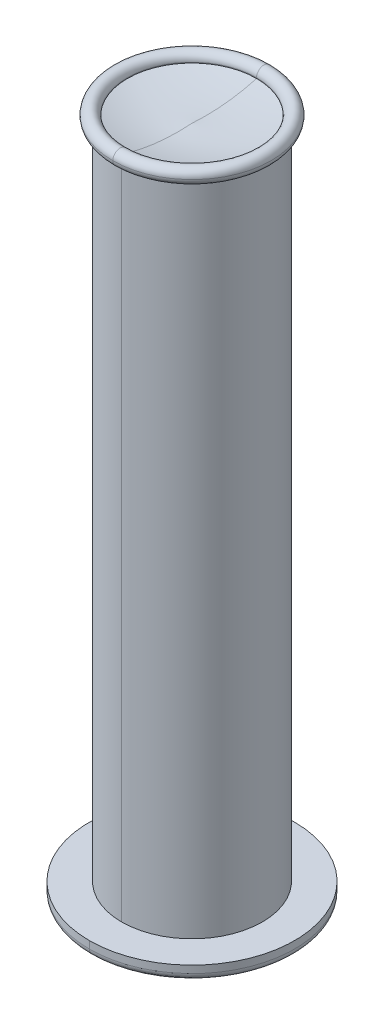
ISO-10303-21;
HEADER;
FILE_DESCRIPTION(('STEP AP214'),'2;1');
FILE_NAME('part.step','',(''),(''),'','','');
FILE_SCHEMA(('AUTOMOTIVE_DESIGN { 1 0 10303 214 1 1 1 1 }'));
ENDSEC;
DATA;
#1=APPLICATION_CONTEXT('core data for automotive mechanical design processes');
#2=APPLICATION_PROTOCOL_DEFINITION('international standard','automotive_design',2000,#1);
#3=PRODUCT_CONTEXT('',#1,'mechanical');
#4=PRODUCT('Part','Part','',(#3));
#5=PRODUCT_RELATED_PRODUCT_CATEGORY('part','',(#4));
#6=PRODUCT_DEFINITION_FORMATION('','',#4);
#7=PRODUCT_DEFINITION_CONTEXT('part definition',#1,'design');
#8=PRODUCT_DEFINITION('design','',#6,#7);
#9=PRODUCT_DEFINITION_SHAPE('','',#8);
#10=(LENGTH_UNIT() NAMED_UNIT(*) SI_UNIT(.MILLI.,.METRE.));
#11=(NAMED_UNIT(*) PLANE_ANGLE_UNIT() SI_UNIT($,.RADIAN.));
#12=(NAMED_UNIT(*) SI_UNIT($,.STERADIAN.) SOLID_ANGLE_UNIT());
#13=UNCERTAINTY_MEASURE_WITH_UNIT(LENGTH_MEASURE(1.E-05),#10,'distance_accuracy_value','');
#14=(GEOMETRIC_REPRESENTATION_CONTEXT(3) GLOBAL_UNCERTAINTY_ASSIGNED_CONTEXT((#13)) GLOBAL_UNIT_ASSIGNED_CONTEXT((#10,
#11,#12)) REPRESENTATION_CONTEXT('',''));
#15=CARTESIAN_POINT('',(0.,0.,0.));
#16=DIRECTION('',(0.,0.,1.));
#17=DIRECTION('',(1.,0.,0.));
#18=AXIS2_PLACEMENT_3D('',#15,#16,#17);
#19=CARTESIAN_POINT('',(0.,28.7584799102785,0.));
#20=DIRECTION('',(0.,-1.,0.));
#21=DIRECTION('',(0.,0.,-1.));
#22=AXIS2_PLACEMENT_3D('',#19,#20,#21);
#23=TOROIDAL_SURFACE('',#22,3.1143963501519,0.3175);
#24=CARTESIAN_POINT('',(0.,28.7584799102785,0.));
#25=DIRECTION('',(0.,-1.,0.));
#26=DIRECTION('',(0.,0.,-1.));
#27=AXIS2_PLACEMENT_3D('',#24,#25,#26);
#28=CIRCLE('',#27,2.79689635015189);
#29=CARTESIAN_POINT('',(0.,28.7584799102785,2.79689635015189));
#30=VERTEX_POINT('',#29);
#31=CARTESIAN_POINT('',(0.,28.7584799102785,-2.79689635015189));
#32=VERTEX_POINT('',#31);
#33=EDGE_CURVE('E145',#30,#32,#28,.T.);
#34=ORIENTED_EDGE('',*,*,#33,.F.);
#35=CARTESIAN_POINT('',(0.,28.7584799102785,3.1143963501519));
#36=DIRECTION('',(1.,0.,0.));
#37=DIRECTION('',(0.,0.,-1.));
#38=AXIS2_PLACEMENT_3D('',#35,#36,#37);
#39=CIRCLE('',#38,0.3175);
#40=CARTESIAN_POINT('',(0.,28.7269838744503,2.79846241761676));
#41=VERTEX_POINT('',#40);
#42=EDGE_CURVE('E177',#41,#30,#39,.T.);
#43=ORIENTED_EDGE('',*,*,#42,.F.);
#44=CARTESIAN_POINT('',(0.,28.7269838744503,0.));
#45=DIRECTION('',(0.,-1.,0.));
#46=DIRECTION('',(0.,0.,-1.));
#47=AXIS2_PLACEMENT_3D('',#44,#45,#46);
#48=CIRCLE('',#47,2.79846241761676);
#49=CARTESIAN_POINT('',(0.,28.7269838744503,-2.79846241761676));
#50=VERTEX_POINT('',#49);
#51=EDGE_CURVE('E140',#41,#50,#48,.T.);
#52=ORIENTED_EDGE('',*,*,#51,.T.);
#53=CARTESIAN_POINT('',(0.,28.7584799102785,-3.1143963501519));
#54=DIRECTION('',(-1.,0.,0.));
#55=DIRECTION('',(0.,0.,1.));
#56=AXIS2_PLACEMENT_3D('',#53,#54,#55);
#57=CIRCLE('',#56,0.3175);
#58=EDGE_CURVE('E178',#50,#32,#57,.T.);
#59=ORIENTED_EDGE('',*,*,#58,.T.);
#60=EDGE_LOOP('',(#34,#43,#52,#59));
#61=FACE_BOUND('',#60,.T.);
#62=ADVANCED_FACE('F16',(#61),#23,.T.);
#63=CARTESIAN_POINT('',(0.,0.,0.));
#64=DIRECTION('',(0.,-1.,0.));
#65=DIRECTION('',(0.,0.,-1.));
#66=AXIS2_PLACEMENT_3D('',#63,#64,#65);
#67=CYLINDRICAL_SURFACE('',#66,3.048);
#68=DIRECTION('',(0.,-1.,0.));
#69=VECTOR('',#68,1.);
#70=CARTESIAN_POINT('',(0.,0.,3.048));
#71=LINE('',#70,#69);
#72=CARTESIAN_POINT('',(0.,28.448,3.048));
#73=VERTEX_POINT('',#72);
#74=CARTESIAN_POINT('',(0.,0.,3.048));
#75=VERTEX_POINT('',#74);
#76=EDGE_CURVE('E186',#73,#75,#71,.T.);
#77=ORIENTED_EDGE('',*,*,#76,.F.);
#78=CARTESIAN_POINT('',(0.,28.448,0.));
#79=DIRECTION('',(0.,-1.,0.));
#80=DIRECTION('',(0.,0.,-1.));
#81=AXIS2_PLACEMENT_3D('',#78,#79,#80);
#82=CIRCLE('',#81,3.048);
#83=CARTESIAN_POINT('',(0.,28.448,-3.048));
#84=VERTEX_POINT('',#83);
#85=EDGE_CURVE('E146',#73,#84,#82,.T.);
#86=ORIENTED_EDGE('',*,*,#85,.T.);
#87=DIRECTION('',(0.,-1.,0.));
#88=VECTOR('',#87,1.);
#89=CARTESIAN_POINT('',(0.,0.,-3.048));
#90=LINE('',#89,#88);
#91=CARTESIAN_POINT('',(0.,0.,-3.048));
#92=VERTEX_POINT('',#91);
#93=EDGE_CURVE('E187',#84,#92,#90,.T.);
#94=ORIENTED_EDGE('',*,*,#93,.T.);
#95=CARTESIAN_POINT('',(0.,0.,0.));
#96=DIRECTION('',(0.,-1.,0.));
#97=DIRECTION('',(0.,0.,-1.));
#98=AXIS2_PLACEMENT_3D('',#95,#96,#97);
#99=CIRCLE('',#98,3.048);
#100=EDGE_CURVE('E11',#75,#92,#99,.T.);
#101=ORIENTED_EDGE('',*,*,#100,.F.);
#102=EDGE_LOOP('',(#77,#86,#94,#101));
#103=FACE_BOUND('',#102,.T.);
#104=ADVANCED_FACE('F227',(#103),#67,.T.);
#105=CARTESIAN_POINT('',(4.445,0.,0.));
#106=DIRECTION('',(0.,1.,0.));
#107=DIRECTION('',(1.,0.,0.));
#108=AXIS2_PLACEMENT_3D('',#105,#106,#107);
#109=PLANE('',#108);
#110=CARTESIAN_POINT('',(0.,0.,0.));
#111=DIRECTION('',(0.,-1.,0.));
#112=DIRECTION('',(0.,0.,-1.));
#113=AXIS2_PLACEMENT_3D('',#110,#111,#112);
#114=CIRCLE('',#113,3.048);
#115=EDGE_CURVE('E192',#92,#75,#114,.T.);
#116=ORIENTED_EDGE('',*,*,#115,.T.);
#117=ORIENTED_EDGE('',*,*,#100,.T.);
#118=EDGE_LOOP('',(#116,#117));
#119=FACE_BOUND('',#118,.T.);
#120=CARTESIAN_POINT('',(0.,0.,0.));
#121=DIRECTION('',(0.,-1.,0.));
#122=DIRECTION('',(0.,0.,-1.));
#123=AXIS2_PLACEMENT_3D('',#120,#121,#122);
#124=CIRCLE('',#123,4.445);
#125=CARTESIAN_POINT('',(0.,0.,-4.445));
#126=VERTEX_POINT('',#125);
#127=CARTESIAN_POINT('',(0.,0.,4.445));
#128=VERTEX_POINT('',#127);
#129=EDGE_CURVE('E191',#126,#128,#124,.T.);
#130=ORIENTED_EDGE('',*,*,#129,.F.);
#131=CARTESIAN_POINT('',(0.,0.,0.));
#132=DIRECTION('',(0.,-1.,0.));
#133=DIRECTION('',(0.,0.,-1.));
#134=AXIS2_PLACEMENT_3D('',#131,#132,#133);
#135=CIRCLE('',#134,4.445);
#136=EDGE_CURVE('E27',#128,#126,#135,.T.);
#137=ORIENTED_EDGE('',*,*,#136,.F.);
#138=EDGE_LOOP('',(#130,#137));
#139=FACE_BOUND('',#138,.T.);
#140=ADVANCED_FACE('F225',(#119,#139),#109,.T.);
#141=CARTESIAN_POINT('',(0.,0.,0.));
#142=DIRECTION('',(0.,-1.,0.));
#143=DIRECTION('',(0.,0.,-1.));
#144=AXIS2_PLACEMENT_3D('',#141,#142,#143);
#145=CYLINDRICAL_SURFACE('',#144,4.445);
#146=DIRECTION('',(0.,-1.,0.));
#147=VECTOR('',#146,1.);
#148=CARTESIAN_POINT('',(0.,0.,4.445));
#149=LINE('',#148,#147);
#150=CARTESIAN_POINT('',(0.,-0.3175,4.445));
#151=VERTEX_POINT('',#150);
#152=EDGE_CURVE('E134',#128,#151,#149,.T.);
#153=ORIENTED_EDGE('',*,*,#152,.F.);
#154=ORIENTED_EDGE('',*,*,#136,.T.);
#155=DIRECTION('',(0.,-1.,0.));
#156=VECTOR('',#155,1.);
#157=CARTESIAN_POINT('',(0.,0.,-4.445));
#158=LINE('',#157,#156);
#159=CARTESIAN_POINT('',(0.,-0.3175,-4.445));
#160=VERTEX_POINT('',#159);
#161=EDGE_CURVE('E120',#126,#160,#158,.T.);
#162=ORIENTED_EDGE('',*,*,#161,.T.);
#163=CARTESIAN_POINT('',(0.,-0.3175,0.));
#164=DIRECTION('',(0.,-1.,0.));
#165=DIRECTION('',(0.,0.,-1.));
#166=AXIS2_PLACEMENT_3D('',#163,#164,#165);
#167=CIRCLE('',#166,4.445);
#168=EDGE_CURVE('E108',#151,#160,#167,.T.);
#169=ORIENTED_EDGE('',*,*,#168,.F.);
#170=EDGE_LOOP('',(#153,#154,#162,#169));
#171=FACE_BOUND('',#170,.T.);
#172=ADVANCED_FACE('F222',(#171),#145,.T.);
#173=CARTESIAN_POINT('',(0.,-0.3175,0.));
#174=DIRECTION('',(0.,-1.,0.));
#175=DIRECTION('',(0.,0.,-1.));
#176=AXIS2_PLACEMENT_3D('',#173,#174,#175);
#177=TOROIDAL_SURFACE('',#176,4.1275,0.3175);
#178=CARTESIAN_POINT('',(0.,-0.3175,4.1275));
#179=DIRECTION('',(1.,0.,0.));
#180=DIRECTION('',(0.,0.,-1.));
#181=AXIS2_PLACEMENT_3D('',#178,#179,#180);
#182=CIRCLE('',#181,0.3175);
#183=CARTESIAN_POINT('',(0.,-0.635,4.1275));
#184=VERTEX_POINT('',#183);
#185=EDGE_CURVE('E20',#151,#184,#182,.T.);
#186=ORIENTED_EDGE('',*,*,#185,.F.);
#187=ORIENTED_EDGE('',*,*,#168,.T.);
#188=CARTESIAN_POINT('',(0.,-0.3175,-4.1275));
#189=DIRECTION('',(-1.,0.,0.));
#190=DIRECTION('',(0.,0.,1.));
#191=AXIS2_PLACEMENT_3D('',#188,#189,#190);
#192=CIRCLE('',#191,0.3175);
#193=CARTESIAN_POINT('',(0.,-0.635,-4.1275));
#194=VERTEX_POINT('',#193);
#195=EDGE_CURVE('E104',#160,#194,#192,.T.);
#196=ORIENTED_EDGE('',*,*,#195,.T.);
#197=CARTESIAN_POINT('',(0.,-0.635,0.));
#198=DIRECTION('',(0.,-1.,0.));
#199=DIRECTION('',(0.,0.,-1.));
#200=AXIS2_PLACEMENT_3D('',#197,#198,#199);
#201=CIRCLE('',#200,4.1275);
#202=EDGE_CURVE('E98',#184,#194,#201,.T.);
#203=ORIENTED_EDGE('',*,*,#202,.F.);
#204=EDGE_LOOP('',(#186,#187,#196,#203));
#205=FACE_BOUND('',#204,.T.);
#206=ADVANCED_FACE('F100',(#205),#177,.T.);
#207=CARTESIAN_POINT('',(0.,-0.635,0.));
#208=DIRECTION('',(0.,-1.,0.));
#209=DIRECTION('',(0.,0.,-1.));
#210=AXIS2_PLACEMENT_3D('',#207,#208,#209);
#211=PLANE('',#210);
#212=CARTESIAN_POINT('',(0.,-0.635,0.));
#213=DIRECTION('',(0.,-1.,0.));
#214=DIRECTION('',(0.,0.,-1.));
#215=AXIS2_PLACEMENT_3D('',#212,#213,#214);
#216=CIRCLE('',#215,4.1275);
#217=EDGE_CURVE('E110',#194,#184,#216,.T.);
#218=ORIENTED_EDGE('',*,*,#217,.T.);
#219=ORIENTED_EDGE('',*,*,#202,.T.);
#220=EDGE_LOOP('',(#218,#219));
#221=FACE_BOUND('',#220,.T.);
#222=ADVANCED_FACE('F111',(#221),#211,.T.);
#223=CARTESIAN_POINT('',(0.,36.5958304601756,-0.600865186460658));
#224=DIRECTION('',(-1.,0.,0.));
#225=DIRECTION('',(0.,0.,-1.));
#226=AXIS2_PLACEMENT_3D('',#223,#224,#225);
#227=CIRCLE('',#226,8.1699559472537);
#228=TRIMMED_CURVE('',#227,(PARAMETER_VALUE(-1.6444084968151)),
(PARAMETER_VALUE(1.6444084968151)),.T.,.PARAMETER.);
#229=CARTESIAN_POINT('',(0.,36.5958304601756,0.));
#230=DIRECTION('',(0.,-1.,0.));
#231=AXIS1_PLACEMENT('',#229,#230);
#232=SURFACE_OF_REVOLUTION('',#228,#231);
#233=CARTESIAN_POINT('',(0.,36.5958304601756,0.600865186460658));
#234=DIRECTION('',(1.,0.,0.));
#235=DIRECTION('',(0.,0.,-1.));
#236=AXIS2_PLACEMENT_3D('',#233,#234,#235);
#237=CIRCLE('',#236,8.1699559472537);
#238=CARTESIAN_POINT('',(0.,28.448,0.));
#239=VERTEX_POINT('',#238);
#240=EDGE_CURVE('E154',#41,#239,#237,.T.);
#241=ORIENTED_EDGE('',*,*,#240,.F.);
#242=CARTESIAN_POINT('',(0.,28.7269838744503,0.));
#243=DIRECTION('',(0.,-1.,0.));
#244=DIRECTION('',(0.,0.,-1.));
#245=AXIS2_PLACEMENT_3D('',#242,#243,#244);
#246=CIRCLE('',#245,2.79846241761676);
#247=EDGE_CURVE('E174',#50,#41,#246,.T.);
#248=ORIENTED_EDGE('',*,*,#247,.F.);
#249=CARTESIAN_POINT('',(0.,36.5958304601756,-0.600865186460658));
#250=DIRECTION('',(-1.,0.,0.));
#251=DIRECTION('',(0.,0.,1.));
#252=AXIS2_PLACEMENT_3D('',#249,#250,#251);
#253=CIRCLE('',#252,8.1699559472537);
#254=EDGE_CURVE('E42',#50,#239,#253,.T.);
#255=ORIENTED_EDGE('',*,*,#254,.T.);
#256=EDGE_LOOP('',(#241,#248,#255));
#257=FACE_BOUND('',#256,.T.);
#258=ADVANCED_FACE('F264',(#257),#232,.F.);
#259=CARTESIAN_POINT('',(0.,36.5958304601756,-0.600865186460658));
#260=DIRECTION('',(-1.,0.,0.));
#261=DIRECTION('',(0.,0.,-1.));
#262=AXIS2_PLACEMENT_3D('',#259,#260,#261);
#263=CIRCLE('',#262,8.1699559472537);
#264=TRIMMED_CURVE('',#263,(PARAMETER_VALUE(-1.6444084968151)),
(PARAMETER_VALUE(1.6444084968151)),.T.,.PARAMETER.);
#265=CARTESIAN_POINT('',(0.,36.5958304601756,0.));
#266=DIRECTION('',(0.,-1.,0.));
#267=AXIS1_PLACEMENT('',#265,#266);
#268=SURFACE_OF_REVOLUTION('',#264,#267);
#269=ORIENTED_EDGE('',*,*,#51,.F.);
#270=ORIENTED_EDGE('',*,*,#240,.T.);
#271=ORIENTED_EDGE('',*,*,#254,.F.);
#272=EDGE_LOOP('',(#269,#270,#271));
#273=FACE_BOUND('',#272,.T.);
#274=ADVANCED_FACE('F263',(#273),#268,.F.);
#275=CARTESIAN_POINT('',(0.,-0.3175,0.));
#276=DIRECTION('',(0.,-1.,0.));
#277=DIRECTION('',(0.,0.,-1.));
#278=AXIS2_PLACEMENT_3D('',#275,#276,#277);
#279=TOROIDAL_SURFACE('',#278,4.1275,0.3175);
#280=CARTESIAN_POINT('',(0.,-0.3175,0.));
#281=DIRECTION('',(0.,-1.,0.));
#282=DIRECTION('',(0.,0.,-1.));
#283=AXIS2_PLACEMENT_3D('',#280,#281,#282);
#284=CIRCLE('',#283,4.445);
#285=EDGE_CURVE('E117',#160,#151,#284,.T.);
#286=ORIENTED_EDGE('',*,*,#285,.T.);
#287=ORIENTED_EDGE('',*,*,#185,.T.);
#288=ORIENTED_EDGE('',*,*,#217,.F.);
#289=ORIENTED_EDGE('',*,*,#195,.F.);
#290=EDGE_LOOP('',(#286,#287,#288,#289));
#291=FACE_BOUND('',#290,.T.);
#292=ADVANCED_FACE('F115',(#291),#279,.T.);
#293=CARTESIAN_POINT('',(0.,0.,0.));
#294=DIRECTION('',(0.,-1.,0.));
#295=DIRECTION('',(0.,0.,-1.));
#296=AXIS2_PLACEMENT_3D('',#293,#294,#295);
#297=CYLINDRICAL_SURFACE('',#296,4.445);
#298=ORIENTED_EDGE('',*,*,#129,.T.);
#299=ORIENTED_EDGE('',*,*,#152,.T.);
#300=ORIENTED_EDGE('',*,*,#285,.F.);
#301=ORIENTED_EDGE('',*,*,#161,.F.);
#302=EDGE_LOOP('',(#298,#299,#300,#301));
#303=FACE_BOUND('',#302,.T.);
#304=ADVANCED_FACE('F224',(#303),#297,.T.);
#305=CARTESIAN_POINT('',(0.,0.,0.));
#306=DIRECTION('',(0.,-1.,0.));
#307=DIRECTION('',(0.,0.,-1.));
#308=AXIS2_PLACEMENT_3D('',#305,#306,#307);
#309=CYLINDRICAL_SURFACE('',#308,3.048);
#310=CARTESIAN_POINT('',(0.,28.448,0.));
#311=DIRECTION('',(0.,-1.,0.));
#312=DIRECTION('',(0.,0.,-1.));
#313=AXIS2_PLACEMENT_3D('',#310,#311,#312);
#314=CIRCLE('',#313,3.048);
#315=EDGE_CURVE('E137',#84,#73,#314,.T.);
#316=ORIENTED_EDGE('',*,*,#315,.T.);
#317=ORIENTED_EDGE('',*,*,#76,.T.);
#318=ORIENTED_EDGE('',*,*,#115,.F.);
#319=ORIENTED_EDGE('',*,*,#93,.F.);
#320=EDGE_LOOP('',(#316,#317,#318,#319));
#321=FACE_BOUND('',#320,.T.);
#322=ADVANCED_FACE('F259',(#321),#309,.T.);
#323=CARTESIAN_POINT('',(0.,28.7584799102785,0.));
#324=DIRECTION('',(0.,-1.,0.));
#325=DIRECTION('',(0.,0.,-1.));
#326=AXIS2_PLACEMENT_3D('',#323,#324,#325);
#327=TOROIDAL_SURFACE('',#326,3.1143963501519,0.3175);
#328=CARTESIAN_POINT('',(0.,28.7584799102785,0.));
#329=DIRECTION('',(0.,-1.,0.));
#330=DIRECTION('',(0.,0.,-1.));
#331=AXIS2_PLACEMENT_3D('',#328,#329,#330);
#332=CIRCLE('',#331,2.79689635015189);
#333=EDGE_CURVE('E180',#32,#30,#332,.T.);
#334=ORIENTED_EDGE('',*,*,#333,.F.);
#335=ORIENTED_EDGE('',*,*,#58,.F.);
#336=ORIENTED_EDGE('',*,*,#247,.T.);
#337=ORIENTED_EDGE('',*,*,#42,.T.);
#338=EDGE_LOOP('',(#334,#335,#336,#337));
#339=FACE_BOUND('',#338,.T.);
#340=ADVANCED_FACE('F255',(#339),#327,.T.);
#341=CARTESIAN_POINT('',(0.,28.7584799102785,0.));
#342=DIRECTION('',(0.,-1.,0.));
#343=DIRECTION('',(0.,0.,-1.));
#344=AXIS2_PLACEMENT_3D('',#341,#342,#343);
#345=TOROIDAL_SURFACE('',#344,3.1143963501519,0.3175);
#346=CARTESIAN_POINT('',(0.,28.7584799102785,0.));
#347=DIRECTION('',(0.,-1.,0.));
#348=DIRECTION('',(0.,0.,-1.));
#349=AXIS2_PLACEMENT_3D('',#346,#347,#348);
#350=CIRCLE('',#349,3.4318963501519);
#351=CARTESIAN_POINT('',(0.,28.7584799102785,-3.4318963501519));
#352=VERTEX_POINT('',#351);
#353=CARTESIAN_POINT('',(0.,28.7584799102785,3.4318963501519));
#354=VERTEX_POINT('',#353);
#355=EDGE_CURVE('E151',#352,#354,#350,.T.);
#356=ORIENTED_EDGE('',*,*,#355,.F.);
#357=CARTESIAN_POINT('',(0.,28.7584799102785,-3.1143963501519));
#358=DIRECTION('',(-1.,0.,0.));
#359=DIRECTION('',(0.,0.,1.));
#360=AXIS2_PLACEMENT_3D('',#357,#358,#359);
#361=CIRCLE('',#360,0.3175);
#362=EDGE_CURVE('E147',#32,#352,#361,.T.);
#363=ORIENTED_EDGE('',*,*,#362,.F.);
#364=ORIENTED_EDGE('',*,*,#333,.T.);
#365=CARTESIAN_POINT('',(0.,28.7584799102785,3.1143963501519));
#366=DIRECTION('',(1.,0.,0.));
#367=DIRECTION('',(0.,0.,-1.));
#368=AXIS2_PLACEMENT_3D('',#365,#366,#367);
#369=CIRCLE('',#368,0.3175);
#370=EDGE_CURVE('E141',#30,#354,#369,.T.);
#371=ORIENTED_EDGE('',*,*,#370,.T.);
#372=EDGE_LOOP('',(#356,#363,#364,#371));
#373=FACE_BOUND('',#372,.T.);
#374=ADVANCED_FACE('F258',(#373),#345,.T.);
#375=CARTESIAN_POINT('',(0.,28.7584799102785,0.));
#376=DIRECTION('',(0.,-1.,0.));
#377=DIRECTION('',(0.,0.,-1.));
#378=AXIS2_PLACEMENT_3D('',#375,#376,#377);
#379=TOROIDAL_SURFACE('',#378,3.1143963501519,0.3175);
#380=CARTESIAN_POINT('',(0.,28.7584799102785,-3.1143963501519));
#381=DIRECTION('',(-1.,0.,0.));
#382=DIRECTION('',(0.,0.,1.));
#383=AXIS2_PLACEMENT_3D('',#380,#381,#382);
#384=CIRCLE('',#383,0.3175);
#385=EDGE_CURVE('E170',#352,#84,#384,.T.);
#386=ORIENTED_EDGE('',*,*,#385,.F.);
#387=ORIENTED_EDGE('',*,*,#355,.T.);
#388=CARTESIAN_POINT('',(0.,28.7584799102785,3.1143963501519));
#389=DIRECTION('',(1.,0.,0.));
#390=DIRECTION('',(0.,0.,-1.));
#391=AXIS2_PLACEMENT_3D('',#388,#389,#390);
#392=CIRCLE('',#391,0.3175);
#393=EDGE_CURVE('E292',#354,#73,#392,.T.);
#394=ORIENTED_EDGE('',*,*,#393,.T.);
#395=ORIENTED_EDGE('',*,*,#315,.F.);
#396=EDGE_LOOP('',(#386,#387,#394,#395));
#397=FACE_BOUND('',#396,.T.);
#398=ADVANCED_FACE('F18',(#397),#379,.T.);
#399=CARTESIAN_POINT('',(0.,28.7584799102785,0.));
#400=DIRECTION('',(0.,-1.,0.));
#401=DIRECTION('',(0.,0.,-1.));
#402=AXIS2_PLACEMENT_3D('',#399,#400,#401);
#403=TOROIDAL_SURFACE('',#402,3.1143963501519,0.3175);
#404=CARTESIAN_POINT('',(0.,28.7584799102785,0.));
#405=DIRECTION('',(0.,-1.,0.));
#406=DIRECTION('',(0.,0.,-1.));
#407=AXIS2_PLACEMENT_3D('',#404,#405,#406);
#408=CIRCLE('',#407,3.4318963501519);
#409=EDGE_CURVE('E173',#354,#352,#408,.T.);
#410=ORIENTED_EDGE('',*,*,#409,.F.);
#411=ORIENTED_EDGE('',*,*,#370,.F.);
#412=ORIENTED_EDGE('',*,*,#33,.T.);
#413=ORIENTED_EDGE('',*,*,#362,.T.);
#414=EDGE_LOOP('',(#410,#411,#412,#413));
#415=FACE_BOUND('',#414,.T.);
#416=ADVANCED_FACE('F250',(#415),#403,.T.);
#417=CARTESIAN_POINT('',(0.,28.7584799102785,0.));
#418=DIRECTION('',(0.,-1.,0.));
#419=DIRECTION('',(0.,0.,-1.));
#420=AXIS2_PLACEMENT_3D('',#417,#418,#419);
#421=TOROIDAL_SURFACE('',#420,3.1143963501519,0.3175);
#422=ORIENTED_EDGE('',*,*,#393,.F.);
#423=ORIENTED_EDGE('',*,*,#409,.T.);
#424=ORIENTED_EDGE('',*,*,#385,.T.);
#425=ORIENTED_EDGE('',*,*,#85,.F.);
#426=EDGE_LOOP('',(#422,#423,#424,#425));
#427=FACE_BOUND('',#426,.T.);
#428=ADVANCED_FACE('F247',(#427),#421,.T.);
#429=CLOSED_SHELL('',(#62,#104,#140,#172,#206,#222,#258,#274,#292,#304,#322,#340,#374,#398,#416,#428));
#430=MANIFOLD_SOLID_BREP('B1',#429);
#431=ADVANCED_BREP_SHAPE_REPRESENTATION('',(#18,#430),#14);
#432=SHAPE_DEFINITION_REPRESENTATION(#9,#431);
ENDSEC;
END-ISO-10303-21;
